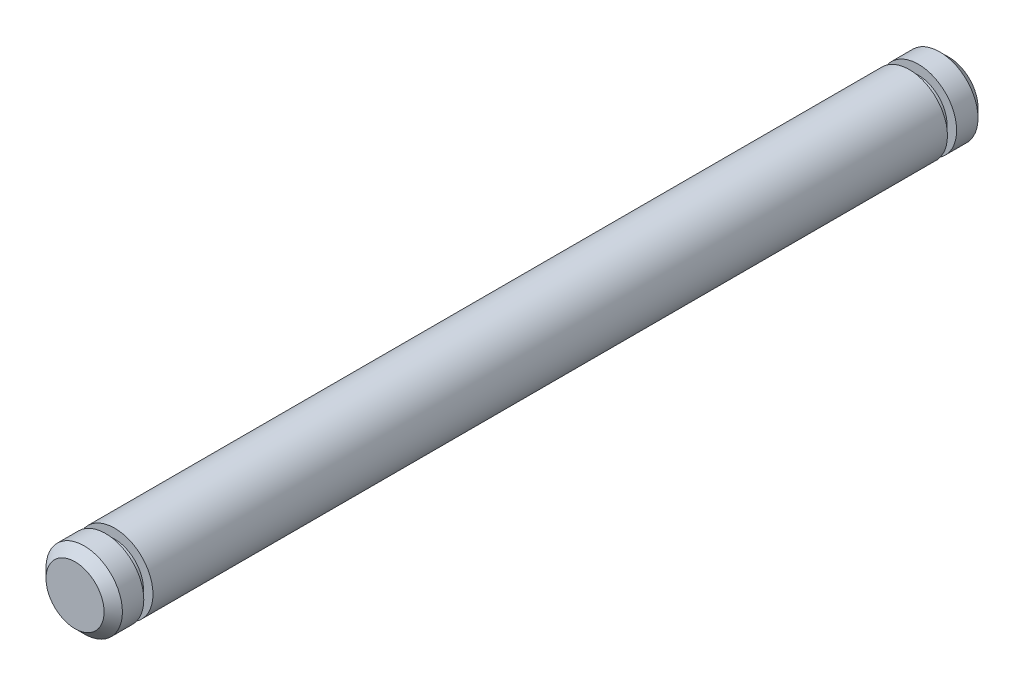
ISO-10303-21;
HEADER;
FILE_DESCRIPTION(('STEP AP214'),'2;1');
FILE_NAME('part.step','',(''),(''),'','','');
FILE_SCHEMA(('AUTOMOTIVE_DESIGN { 1 0 10303 214 1 1 1 1 }'));
ENDSEC;
DATA;
#1=APPLICATION_CONTEXT('core data for automotive mechanical design processes');
#2=APPLICATION_PROTOCOL_DEFINITION('international standard','automotive_design',2000,#1);
#3=PRODUCT_CONTEXT('',#1,'mechanical');
#4=PRODUCT('Part','Part','',(#3));
#5=PRODUCT_RELATED_PRODUCT_CATEGORY('part','',(#4));
#6=PRODUCT_DEFINITION_FORMATION('','',#4);
#7=PRODUCT_DEFINITION_CONTEXT('part definition',#1,'design');
#8=PRODUCT_DEFINITION('design','',#6,#7);
#9=PRODUCT_DEFINITION_SHAPE('','',#8);
#10=(LENGTH_UNIT() NAMED_UNIT(*) SI_UNIT(.MILLI.,.METRE.));
#11=(NAMED_UNIT(*) PLANE_ANGLE_UNIT() SI_UNIT($,.RADIAN.));
#12=(NAMED_UNIT(*) SI_UNIT($,.STERADIAN.) SOLID_ANGLE_UNIT());
#13=UNCERTAINTY_MEASURE_WITH_UNIT(LENGTH_MEASURE(1.E-05),#10,'distance_accuracy_value','');
#14=(GEOMETRIC_REPRESENTATION_CONTEXT(3) GLOBAL_UNCERTAINTY_ASSIGNED_CONTEXT((#13)) GLOBAL_UNIT_ASSIGNED_CONTEXT((#10,
#11,#12)) REPRESENTATION_CONTEXT('',''));
#15=CARTESIAN_POINT('',(0.,0.,0.));
#16=DIRECTION('',(0.,0.,1.));
#17=DIRECTION('',(1.,0.,0.));
#18=AXIS2_PLACEMENT_3D('',#15,#16,#17);
#19=CARTESIAN_POINT('',(0.,0.,16.50746));
#20=DIRECTION('',(0.,0.,-1.));
#21=DIRECTION('',(-1.,0.,0.));
#22=AXIS2_PLACEMENT_3D('',#19,#20,#21);
#23=CYLINDRICAL_SURFACE('',#22,1.5875);
#24=CARTESIAN_POINT('',(0.,0.,16.50746));
#25=DIRECTION('',(0.,0.,1.));
#26=DIRECTION('',(1.,0.,0.));
#27=AXIS2_PLACEMENT_3D('',#24,#25,#26);
#28=CIRCLE('',#27,1.5875);
#29=CARTESIAN_POINT('',(1.5875,0.,16.50746));
#30=VERTEX_POINT('',#29);
#31=EDGE_CURVE('E68',#30,#30,#28,.T.);
#32=ORIENTED_EDGE('',*,*,#31,.F.);
#33=EDGE_LOOP('',(#32));
#34=FACE_BOUND('',#33,.T.);
#35=CARTESIAN_POINT('',(0.,0.,-16.50746));
#36=DIRECTION('',(0.,0.,1.));
#37=DIRECTION('',(1.,0.,0.));
#38=AXIS2_PLACEMENT_3D('',#35,#36,#37);
#39=CIRCLE('',#38,1.5875);
#40=CARTESIAN_POINT('',(1.5875,0.,-16.50746));
#41=VERTEX_POINT('',#40);
#42=EDGE_CURVE('E65',#41,#41,#39,.T.);
#43=ORIENTED_EDGE('',*,*,#42,.T.);
#44=EDGE_LOOP('',(#43));
#45=FACE_BOUND('',#44,.T.);
#46=ADVANCED_FACE('F43',(#34,#45),#23,.T.);
#47=CARTESIAN_POINT('',(0.,0.,16.50746));
#48=DIRECTION('',(0.,0.,1.));
#49=DIRECTION('',(1.,0.,0.));
#50=AXIS2_PLACEMENT_3D('',#47,#48,#49);
#51=PLANE('',#50);
#52=CARTESIAN_POINT('',(0.,0.,16.50746));
#53=DIRECTION('',(0.,0.,1.));
#54=DIRECTION('',(1.,0.,0.));
#55=AXIS2_PLACEMENT_3D('',#52,#53,#54);
#56=CIRCLE('',#55,1.19126);
#57=CARTESIAN_POINT('',(-1.19126,0.,16.50746));
#58=VERTEX_POINT('',#57);
#59=EDGE_CURVE('E64',#58,#58,#56,.T.);
#60=ORIENTED_EDGE('',*,*,#59,.F.);
#61=EDGE_LOOP('',(#60));
#62=FACE_BOUND('',#61,.T.);
#63=ORIENTED_EDGE('',*,*,#31,.T.);
#64=EDGE_LOOP('',(#63));
#65=FACE_BOUND('',#64,.T.);
#66=ADVANCED_FACE('F106',(#62,#65),#51,.T.);
#67=CARTESIAN_POINT('',(0.,0.,-16.50746));
#68=DIRECTION('',(0.,0.,1.));
#69=DIRECTION('',(1.,0.,0.));
#70=AXIS2_PLACEMENT_3D('',#67,#68,#69);
#71=PLANE('',#70);
#72=CARTESIAN_POINT('',(0.,0.,-16.50746));
#73=DIRECTION('',(0.,0.,1.));
#74=DIRECTION('',(1.,0.,0.));
#75=AXIS2_PLACEMENT_3D('',#72,#73,#74);
#76=CIRCLE('',#75,1.19126);
#77=CARTESIAN_POINT('',(1.19126,0.,-16.50746));
#78=VERTEX_POINT('',#77);
#79=EDGE_CURVE('E79',#78,#78,#76,.T.);
#80=ORIENTED_EDGE('',*,*,#79,.T.);
#81=EDGE_LOOP('',(#80));
#82=FACE_BOUND('',#81,.T.);
#83=ORIENTED_EDGE('',*,*,#42,.F.);
#84=EDGE_LOOP('',(#83));
#85=FACE_BOUND('',#84,.T.);
#86=ADVANCED_FACE('F112',(#82,#85),#71,.F.);
#87=CARTESIAN_POINT('',(0.,0.,16.88846));
#88=DIRECTION('',(0.,0.,-1.));
#89=DIRECTION('',(-1.,0.,0.));
#90=AXIS2_PLACEMENT_3D('',#87,#88,#89);
#91=CYLINDRICAL_SURFACE('',#90,1.19126);
#92=CARTESIAN_POINT('',(0.,0.,16.88846));
#93=DIRECTION('',(0.,0.,1.));
#94=DIRECTION('',(1.,0.,0.));
#95=AXIS2_PLACEMENT_3D('',#92,#93,#94);
#96=CIRCLE('',#95,1.19126);
#97=CARTESIAN_POINT('',(-1.19126,0.,16.88846));
#98=VERTEX_POINT('',#97);
#99=EDGE_CURVE('E69',#98,#98,#96,.T.);
#100=CARTESIAN_POINT('',(-1.19126,0.,16.88846));
#101=CARTESIAN_POINT('',(-1.19126,0.,16.88449125));
#102=CARTESIAN_POINT('',(-1.19126,0.,16.8805225));
#103=CARTESIAN_POINT('',(-1.19126,0.,16.872585));
#104=CARTESIAN_POINT('',(-1.19126,0.,16.86861625));
#105=CARTESIAN_POINT('',(-1.19126,0.,16.86067875));
#106=CARTESIAN_POINT('',(-1.19126,0.,16.85671));
#107=CARTESIAN_POINT('',(-1.19126,0.,16.8487725));
#108=CARTESIAN_POINT('',(-1.19126,0.,16.84480375));
#109=CARTESIAN_POINT('',(-1.19126,0.,16.83686625));
#110=CARTESIAN_POINT('',(-1.19126,0.,16.8328975));
#111=CARTESIAN_POINT('',(-1.19126,0.,16.82496));
#112=CARTESIAN_POINT('',(-1.19126,0.,16.82099125));
#113=CARTESIAN_POINT('',(-1.19126,0.,16.81305375));
#114=CARTESIAN_POINT('',(-1.19126,0.,16.809085));
#115=CARTESIAN_POINT('',(-1.19126,0.,16.8011475));
#116=CARTESIAN_POINT('',(-1.19126,0.,16.79717875));
#117=CARTESIAN_POINT('',(-1.19126,0.,16.78924125));
#118=CARTESIAN_POINT('',(-1.19126,0.,16.7852725));
#119=CARTESIAN_POINT('',(-1.19126,0.,16.777335));
#120=CARTESIAN_POINT('',(-1.19126,0.,16.77336625));
#121=CARTESIAN_POINT('',(-1.19126,0.,16.76542875));
#122=CARTESIAN_POINT('',(-1.19126,0.,16.76146));
#123=CARTESIAN_POINT('',(-1.19126,0.,16.7535225));
#124=CARTESIAN_POINT('',(-1.19126,0.,16.74955375));
#125=CARTESIAN_POINT('',(-1.19126,0.,16.74161625));
#126=CARTESIAN_POINT('',(-1.19126,0.,16.7376475));
#127=CARTESIAN_POINT('',(-1.19126,0.,16.72971));
#128=CARTESIAN_POINT('',(-1.19126,0.,16.72574125));
#129=CARTESIAN_POINT('',(-1.19126,0.,16.71780375));
#130=CARTESIAN_POINT('',(-1.19126,0.,16.713835));
#131=CARTESIAN_POINT('',(-1.19126,0.,16.7058975));
#132=CARTESIAN_POINT('',(-1.19126,0.,16.70192875));
#133=CARTESIAN_POINT('',(-1.19126,0.,16.69399125));
#134=CARTESIAN_POINT('',(-1.19126,0.,16.6900225));
#135=CARTESIAN_POINT('',(-1.19126,0.,16.682085));
#136=CARTESIAN_POINT('',(-1.19126,0.,16.67811625));
#137=CARTESIAN_POINT('',(-1.19126,0.,16.67017875));
#138=CARTESIAN_POINT('',(-1.19126,0.,16.66621));
#139=CARTESIAN_POINT('',(-1.19126,0.,16.6582725));
#140=CARTESIAN_POINT('',(-1.19126,0.,16.65430375));
#141=CARTESIAN_POINT('',(-1.19126,0.,16.64636625));
#142=CARTESIAN_POINT('',(-1.19126,0.,16.6423975));
#143=CARTESIAN_POINT('',(-1.19126,0.,16.63446));
#144=CARTESIAN_POINT('',(-1.19126,0.,16.63049125));
#145=CARTESIAN_POINT('',(-1.19126,0.,16.62255375));
#146=CARTESIAN_POINT('',(-1.19126,0.,16.618585));
#147=CARTESIAN_POINT('',(-1.19126,0.,16.6106475));
#148=CARTESIAN_POINT('',(-1.19126,0.,16.60667875));
#149=CARTESIAN_POINT('',(-1.19126,0.,16.59874125));
#150=CARTESIAN_POINT('',(-1.19126,0.,16.5947725));
#151=CARTESIAN_POINT('',(-1.19126,0.,16.586835));
#152=CARTESIAN_POINT('',(-1.19126,0.,16.58286625));
#153=CARTESIAN_POINT('',(-1.19126,0.,16.57492875));
#154=CARTESIAN_POINT('',(-1.19126,0.,16.57096));
#155=CARTESIAN_POINT('',(-1.19126,0.,16.5630225));
#156=CARTESIAN_POINT('',(-1.19126,0.,16.55905375));
#157=CARTESIAN_POINT('',(-1.19126,0.,16.55111625));
#158=CARTESIAN_POINT('',(-1.19126,0.,16.5471475));
#159=CARTESIAN_POINT('',(-1.19126,0.,16.53921));
#160=CARTESIAN_POINT('',(-1.19126,0.,16.53524125));
#161=CARTESIAN_POINT('',(-1.19126,0.,16.52730375));
#162=CARTESIAN_POINT('',(-1.19126,0.,16.523335));
#163=CARTESIAN_POINT('',(-1.19126,0.,16.5153975));
#164=CARTESIAN_POINT('',(-1.19126,0.,16.51142875));
#165=CARTESIAN_POINT('',(-1.19126,0.,16.50746));
#166=B_SPLINE_CURVE_WITH_KNOTS('',3,(#100,#101,#102,#103,#104,#105,#106,#107,#108,#109,#110,
#111,#112,#113,#114,#115,#116,#117,#118,#119,#120,#121,#122,#123,#124,#125,#126,#127,#128,#129,
#130,#131,#132,#133,#134,#135,#136,#137,#138,#139,#140,#141,#142,#143,#144,#145,#146,#147,#148,
#149,#150,#151,#152,#153,#154,#155,#156,#157,#158,#159,#160,#161,#162,#163,#164,#165),
.UNSPECIFIED.,.F.,.F.,(4,2,2,2,2,2,2,2,2,2,2,2,2,2,2,2,2,2,2,2,2,2,2,2,2,2,2,2,2,2,2,2,4),(0.,
0.0119062499999989,0.0238124999999978,0.0357187499999967,0.0476249999999991,0.059531249999998,
0.0714374999999969,0.0833437499999992,0.0952499999999981,0.107156249999997,0.119062499999999,
0.130968749999998,0.142874999999997,0.15478125,0.166687499999998,0.178593749999997,0.1905,
0.202406249999999,0.214312499999997,0.226218749999996,0.238124999999999,0.250031249999998,
0.261937499999997,0.273843749999999,0.285749999999998,0.297656249999997,0.309562499999999,
0.321468749999998,0.333374999999997,0.345281249999999,0.357187499999998,0.369093749999997,
0.380999999999999),.UNSPECIFIED.);
#167=EDGE_CURVE('BSEAM141',#98,#58,#166,.T.);
#168=ORIENTED_EDGE('',*,*,#99,.F.);
#169=ORIENTED_EDGE('',*,*,#59,.T.);
#170=ORIENTED_EDGE('',*,*,#167,.T.);
#171=ORIENTED_EDGE('',*,*,#167,.F.);
#172=EDGE_LOOP('',(#168,#170,#169,#171));
#173=FACE_BOUND('',#172,.T.);
#174=ADVANCED_FACE('F141',(#173),#91,.T.);
#175=CARTESIAN_POINT('',(0.,0.,18.15846));
#176=DIRECTION('',(0.,0.,-1.));
#177=DIRECTION('',(-1.,0.,0.));
#178=AXIS2_PLACEMENT_3D('',#175,#176,#177);
#179=CYLINDRICAL_SURFACE('',#178,1.5875);
#180=CARTESIAN_POINT('',(0.,0.,17.77746));
#181=DIRECTION('',(0.,0.,1.));
#182=DIRECTION('',(1.,0.,0.));
#183=AXIS2_PLACEMENT_3D('',#180,#181,#182);
#184=CIRCLE('',#183,1.5875);
#185=CARTESIAN_POINT('',(1.5875,0.,17.77746));
#186=VERTEX_POINT('',#185);
#187=EDGE_CURVE('E55',#186,#186,#184,.F.);
#188=ORIENTED_EDGE('',*,*,#187,.T.);
#189=EDGE_LOOP('',(#188));
#190=FACE_BOUND('',#189,.T.);
#191=CARTESIAN_POINT('',(0.,0.,16.88846));
#192=DIRECTION('',(0.,0.,1.));
#193=DIRECTION('',(1.,0.,0.));
#194=AXIS2_PLACEMENT_3D('',#191,#192,#193);
#195=CIRCLE('',#194,1.5875);
#196=CARTESIAN_POINT('',(1.5875,0.,16.88846));
#197=VERTEX_POINT('',#196);
#198=EDGE_CURVE('E76',#197,#197,#195,.T.);
#199=ORIENTED_EDGE('',*,*,#198,.T.);
#200=EDGE_LOOP('',(#199));
#201=FACE_BOUND('',#200,.T.);
#202=ADVANCED_FACE('F136',(#190,#201),#179,.T.);
#203=CARTESIAN_POINT('',(0.,0.,18.15846));
#204=DIRECTION('',(0.,0.,1.));
#205=DIRECTION('',(1.,0.,0.));
#206=AXIS2_PLACEMENT_3D('',#203,#204,#205);
#207=PLANE('',#206);
#208=CARTESIAN_POINT('',(0.,0.,18.15846));
#209=DIRECTION('',(0.,0.,1.));
#210=DIRECTION('',(1.,0.,0.));
#211=AXIS2_PLACEMENT_3D('',#208,#209,#210);
#212=CIRCLE('',#211,1.2065);
#213=CARTESIAN_POINT('',(1.2065,0.,18.15846));
#214=VERTEX_POINT('',#213);
#215=EDGE_CURVE('E59',#214,#214,#212,.T.);
#216=ORIENTED_EDGE('',*,*,#215,.T.);
#217=EDGE_LOOP('',(#216));
#218=FACE_BOUND('',#217,.T.);
#219=ADVANCED_FACE('F129',(#218),#207,.T.);
#220=CARTESIAN_POINT('',(0.,0.,16.88846));
#221=DIRECTION('',(0.,0.,1.));
#222=DIRECTION('',(1.,0.,0.));
#223=AXIS2_PLACEMENT_3D('',#220,#221,#222);
#224=PLANE('',#223);
#225=ORIENTED_EDGE('',*,*,#99,.T.);
#226=EDGE_LOOP('',(#225));
#227=FACE_BOUND('',#226,.T.);
#228=ORIENTED_EDGE('',*,*,#198,.F.);
#229=EDGE_LOOP('',(#228));
#230=FACE_BOUND('',#229,.T.);
#231=ADVANCED_FACE('F122',(#227,#230),#224,.F.);
#232=CARTESIAN_POINT('',(0.,0.,18.15846));
#233=DIRECTION('',(0.,0.,-1.));
#234=DIRECTION('',(-1.,0.,0.));
#235=AXIS2_PLACEMENT_3D('',#232,#233,#234);
#236=CONICAL_SURFACE('',#235,1.2065,0.78539816339745);
#237=ORIENTED_EDGE('',*,*,#187,.F.);
#238=EDGE_LOOP('',(#237));
#239=FACE_BOUND('',#238,.T.);
#240=ORIENTED_EDGE('',*,*,#215,.F.);
#241=EDGE_LOOP('',(#240));
#242=FACE_BOUND('',#241,.T.);
#243=ADVANCED_FACE('F101',(#239,#242),#236,.T.);
#244=CARTESIAN_POINT('',(0.,0.,-16.88846));
#245=DIRECTION('',(0.,0.,1.));
#246=DIRECTION('',(1.,0.,0.));
#247=AXIS2_PLACEMENT_3D('',#244,#245,#246);
#248=CYLINDRICAL_SURFACE('',#247,1.19126);
#249=CARTESIAN_POINT('',(0.,0.,-16.88846));
#250=DIRECTION('',(0.,0.,1.));
#251=DIRECTION('',(1.,0.,0.));
#252=AXIS2_PLACEMENT_3D('',#249,#250,#251);
#253=CIRCLE('',#252,1.19126);
#254=CARTESIAN_POINT('',(1.19126,0.,-16.88846));
#255=VERTEX_POINT('',#254);
#256=EDGE_CURVE('E82',#255,#255,#253,.T.);
#257=CARTESIAN_POINT('',(1.19126,0.,-16.88846));
#258=CARTESIAN_POINT('',(1.19126,0.,-16.88449125));
#259=CARTESIAN_POINT('',(1.19126,0.,-16.8805225));
#260=CARTESIAN_POINT('',(1.19126,0.,-16.872585));
#261=CARTESIAN_POINT('',(1.19126,0.,-16.86861625));
#262=CARTESIAN_POINT('',(1.19126,0.,-16.86067875));
#263=CARTESIAN_POINT('',(1.19126,0.,-16.85671));
#264=CARTESIAN_POINT('',(1.19126,0.,-16.8487725));
#265=CARTESIAN_POINT('',(1.19126,0.,-16.84480375));
#266=CARTESIAN_POINT('',(1.19126,0.,-16.83686625));
#267=CARTESIAN_POINT('',(1.19126,0.,-16.8328975));
#268=CARTESIAN_POINT('',(1.19126,0.,-16.82496));
#269=CARTESIAN_POINT('',(1.19126,0.,-16.82099125));
#270=CARTESIAN_POINT('',(1.19126,0.,-16.81305375));
#271=CARTESIAN_POINT('',(1.19126,0.,-16.809085));
#272=CARTESIAN_POINT('',(1.19126,0.,-16.8011475));
#273=CARTESIAN_POINT('',(1.19126,0.,-16.79717875));
#274=CARTESIAN_POINT('',(1.19126,0.,-16.78924125));
#275=CARTESIAN_POINT('',(1.19126,0.,-16.7852725));
#276=CARTESIAN_POINT('',(1.19126,0.,-16.777335));
#277=CARTESIAN_POINT('',(1.19126,0.,-16.77336625));
#278=CARTESIAN_POINT('',(1.19126,0.,-16.76542875));
#279=CARTESIAN_POINT('',(1.19126,0.,-16.76146));
#280=CARTESIAN_POINT('',(1.19126,0.,-16.7535225));
#281=CARTESIAN_POINT('',(1.19126,0.,-16.74955375));
#282=CARTESIAN_POINT('',(1.19126,0.,-16.74161625));
#283=CARTESIAN_POINT('',(1.19126,0.,-16.7376475));
#284=CARTESIAN_POINT('',(1.19126,0.,-16.72971));
#285=CARTESIAN_POINT('',(1.19126,0.,-16.72574125));
#286=CARTESIAN_POINT('',(1.19126,0.,-16.71780375));
#287=CARTESIAN_POINT('',(1.19126,0.,-16.713835));
#288=CARTESIAN_POINT('',(1.19126,0.,-16.7058975));
#289=CARTESIAN_POINT('',(1.19126,0.,-16.70192875));
#290=CARTESIAN_POINT('',(1.19126,0.,-16.69399125));
#291=CARTESIAN_POINT('',(1.19126,0.,-16.6900225));
#292=CARTESIAN_POINT('',(1.19126,0.,-16.682085));
#293=CARTESIAN_POINT('',(1.19126,0.,-16.67811625));
#294=CARTESIAN_POINT('',(1.19126,0.,-16.67017875));
#295=CARTESIAN_POINT('',(1.19126,0.,-16.66621));
#296=CARTESIAN_POINT('',(1.19126,0.,-16.6582725));
#297=CARTESIAN_POINT('',(1.19126,0.,-16.65430375));
#298=CARTESIAN_POINT('',(1.19126,0.,-16.64636625));
#299=CARTESIAN_POINT('',(1.19126,0.,-16.6423975));
#300=CARTESIAN_POINT('',(1.19126,0.,-16.63446));
#301=CARTESIAN_POINT('',(1.19126,0.,-16.63049125));
#302=CARTESIAN_POINT('',(1.19126,0.,-16.62255375));
#303=CARTESIAN_POINT('',(1.19126,0.,-16.618585));
#304=CARTESIAN_POINT('',(1.19126,0.,-16.6106475));
#305=CARTESIAN_POINT('',(1.19126,0.,-16.60667875));
#306=CARTESIAN_POINT('',(1.19126,0.,-16.59874125));
#307=CARTESIAN_POINT('',(1.19126,0.,-16.5947725));
#308=CARTESIAN_POINT('',(1.19126,0.,-16.586835));
#309=CARTESIAN_POINT('',(1.19126,0.,-16.58286625));
#310=CARTESIAN_POINT('',(1.19126,0.,-16.57492875));
#311=CARTESIAN_POINT('',(1.19126,0.,-16.57096));
#312=CARTESIAN_POINT('',(1.19126,0.,-16.5630225));
#313=CARTESIAN_POINT('',(1.19126,0.,-16.55905375));
#314=CARTESIAN_POINT('',(1.19126,0.,-16.55111625));
#315=CARTESIAN_POINT('',(1.19126,0.,-16.5471475));
#316=CARTESIAN_POINT('',(1.19126,0.,-16.53921));
#317=CARTESIAN_POINT('',(1.19126,0.,-16.53524125));
#318=CARTESIAN_POINT('',(1.19126,0.,-16.52730375));
#319=CARTESIAN_POINT('',(1.19126,0.,-16.523335));
#320=CARTESIAN_POINT('',(1.19126,0.,-16.5153975));
#321=CARTESIAN_POINT('',(1.19126,0.,-16.51142875));
#322=CARTESIAN_POINT('',(1.19126,0.,-16.50746));
#323=B_SPLINE_CURVE_WITH_KNOTS('',3,(#257,#258,#259,#260,#261,#262,#263,#264,#265,#266,#267,
#268,#269,#270,#271,#272,#273,#274,#275,#276,#277,#278,#279,#280,#281,#282,#283,#284,#285,#286,
#287,#288,#289,#290,#291,#292,#293,#294,#295,#296,#297,#298,#299,#300,#301,#302,#303,#304,#305,
#306,#307,#308,#309,#310,#311,#312,#313,#314,#315,#316,#317,#318,#319,#320,#321,#322),
.UNSPECIFIED.,.F.,.F.,(4,2,2,2,2,2,2,2,2,2,2,2,2,2,2,2,2,2,2,2,2,2,2,2,2,2,2,2,2,2,2,2,4),(0.,
0.0119062500000024,0.0238125000000013,0.0357187500000002,0.0476250000000025,0.0595312500000014,
0.0714375000000003,0.0833437500000027,0.0952500000000016,0.10715625,0.119062500000003,
0.130968750000002,0.142875000000001,0.154781250000003,0.166687500000002,0.178593750000001,
0.1905,0.202406250000002,0.214312500000001,0.22621875,0.238125000000002,0.250031250000001,
0.2619375,0.273843750000002,0.285750000000001,0.29765625,0.309562500000003,0.321468750000001,
0.333375,0.345281250000003,0.357187500000002,0.36909375,0.380999999999999),.UNSPECIFIED.);
#324=EDGE_CURVE('BSEAM94',#255,#78,#323,.T.);
#325=ORIENTED_EDGE('',*,*,#256,.T.);
#326=ORIENTED_EDGE('',*,*,#79,.F.);
#327=ORIENTED_EDGE('',*,*,#324,.T.);
#328=ORIENTED_EDGE('',*,*,#324,.F.);
#329=EDGE_LOOP('',(#325,#327,#326,#328));
#330=FACE_BOUND('',#329,.T.);
#331=ADVANCED_FACE('F94',(#330),#248,.T.);
#332=CARTESIAN_POINT('',(0.,0.,-18.15846));
#333=DIRECTION('',(0.,0.,1.));
#334=DIRECTION('',(1.,0.,0.));
#335=AXIS2_PLACEMENT_3D('',#332,#333,#334);
#336=CYLINDRICAL_SURFACE('',#335,1.5875);
#337=CARTESIAN_POINT('',(0.,0.,-17.77746));
#338=DIRECTION('',(0.,0.,-1.));
#339=DIRECTION('',(-1.,0.,0.));
#340=AXIS2_PLACEMENT_3D('',#337,#338,#339);
#341=CIRCLE('',#340,1.5875);
#342=CARTESIAN_POINT('',(1.5875,0.,-17.77746));
#343=VERTEX_POINT('',#342);
#344=EDGE_CURVE('E51',#343,#343,#341,.F.);
#345=ORIENTED_EDGE('',*,*,#344,.T.);
#346=EDGE_LOOP('',(#345));
#347=FACE_BOUND('',#346,.T.);
#348=CARTESIAN_POINT('',(0.,0.,-16.88846));
#349=DIRECTION('',(0.,0.,1.));
#350=DIRECTION('',(1.,0.,0.));
#351=AXIS2_PLACEMENT_3D('',#348,#349,#350);
#352=CIRCLE('',#351,1.5875);
#353=CARTESIAN_POINT('',(1.5875,0.,-16.88846));
#354=VERTEX_POINT('',#353);
#355=EDGE_CURVE('E85',#354,#354,#352,.T.);
#356=ORIENTED_EDGE('',*,*,#355,.F.);
#357=EDGE_LOOP('',(#356));
#358=FACE_BOUND('',#357,.T.);
#359=ADVANCED_FACE('F91',(#347,#358),#336,.T.);
#360=CARTESIAN_POINT('',(0.,0.,-18.15846));
#361=DIRECTION('',(0.,0.,-1.));
#362=DIRECTION('',(1.,0.,0.));
#363=AXIS2_PLACEMENT_3D('',#360,#361,#362);
#364=PLANE('',#363);
#365=CARTESIAN_POINT('',(0.,0.,-18.15846));
#366=DIRECTION('',(0.,0.,-1.));
#367=DIRECTION('',(-1.,0.,0.));
#368=AXIS2_PLACEMENT_3D('',#365,#366,#367);
#369=CIRCLE('',#368,1.2065);
#370=CARTESIAN_POINT('',(1.2065,0.,-18.15846));
#371=VERTEX_POINT('',#370);
#372=EDGE_CURVE('E10',#371,#371,#369,.T.);
#373=ORIENTED_EDGE('',*,*,#372,.T.);
#374=EDGE_LOOP('',(#373));
#375=FACE_BOUND('',#374,.T.);
#376=ADVANCED_FACE('F93',(#375),#364,.T.);
#377=CARTESIAN_POINT('',(0.,0.,-16.88846));
#378=DIRECTION('',(0.,0.,-1.));
#379=DIRECTION('',(1.,0.,0.));
#380=AXIS2_PLACEMENT_3D('',#377,#378,#379);
#381=PLANE('',#380);
#382=ORIENTED_EDGE('',*,*,#256,.F.);
#383=EDGE_LOOP('',(#382));
#384=FACE_BOUND('',#383,.T.);
#385=ORIENTED_EDGE('',*,*,#355,.T.);
#386=EDGE_LOOP('',(#385));
#387=FACE_BOUND('',#386,.T.);
#388=ADVANCED_FACE('F89',(#384,#387),#381,.F.);
#389=CARTESIAN_POINT('',(0.,0.,-17.77746));
#390=DIRECTION('',(0.,0.,1.));
#391=DIRECTION('',(1.,0.,0.));
#392=AXIS2_PLACEMENT_3D('',#389,#390,#391);
#393=CONICAL_SURFACE('',#392,1.5875,0.785398163397443);
#394=CARTESIAN_POINT('',(1.2065,0.,-18.15846));
#395=CARTESIAN_POINT('',(1.21046875,0.,-18.15449125));
#396=CARTESIAN_POINT('',(1.2144375,0.,-18.1505225));
#397=CARTESIAN_POINT('',(1.222375,0.,-18.142585));
#398=CARTESIAN_POINT('',(1.22634375,0.,-18.13861625));
#399=CARTESIAN_POINT('',(1.23428125,0.,-18.13067875));
#400=CARTESIAN_POINT('',(1.23825,0.,-18.12671));
#401=CARTESIAN_POINT('',(1.2461875,0.,-18.1187725));
#402=CARTESIAN_POINT('',(1.25015625,0.,-18.11480375));
#403=CARTESIAN_POINT('',(1.25809375,0.,-18.10686625));
#404=CARTESIAN_POINT('',(1.2620625,0.,-18.1028975));
#405=CARTESIAN_POINT('',(1.27,0.,-18.09496));
#406=CARTESIAN_POINT('',(1.27396875,0.,-18.09099125));
#407=CARTESIAN_POINT('',(1.28190625,0.,-18.08305375));
#408=CARTESIAN_POINT('',(1.285875,0.,-18.079085));
#409=CARTESIAN_POINT('',(1.2938125,0.,-18.0711475));
#410=CARTESIAN_POINT('',(1.29778125,0.,-18.06717875));
#411=CARTESIAN_POINT('',(1.30571875,0.,-18.05924125));
#412=CARTESIAN_POINT('',(1.3096875,0.,-18.0552725));
#413=CARTESIAN_POINT('',(1.317625,0.,-18.047335));
#414=CARTESIAN_POINT('',(1.32159375,0.,-18.04336625));
#415=CARTESIAN_POINT('',(1.32953125,0.,-18.03542875));
#416=CARTESIAN_POINT('',(1.3335,0.,-18.03146));
#417=CARTESIAN_POINT('',(1.3414375,0.,-18.0235225));
#418=CARTESIAN_POINT('',(1.34540625,0.,-18.01955375));
#419=CARTESIAN_POINT('',(1.35334375,0.,-18.01161625));
#420=CARTESIAN_POINT('',(1.3573125,0.,-18.0076475));
#421=CARTESIAN_POINT('',(1.36525,0.,-17.99971));
#422=CARTESIAN_POINT('',(1.36921875,0.,-17.99574125));
#423=CARTESIAN_POINT('',(1.37715625,0.,-17.98780375));
#424=CARTESIAN_POINT('',(1.381125,0.,-17.983835));
#425=CARTESIAN_POINT('',(1.3890625,0.,-17.9758975));
#426=CARTESIAN_POINT('',(1.39303125,0.,-17.97192875));
#427=CARTESIAN_POINT('',(1.40096875,0.,-17.96399125));
#428=CARTESIAN_POINT('',(1.4049375,0.,-17.9600225));
#429=CARTESIAN_POINT('',(1.412875,0.,-17.952085));
#430=CARTESIAN_POINT('',(1.41684375,0.,-17.94811625));
#431=CARTESIAN_POINT('',(1.42478125,0.,-17.94017875));
#432=CARTESIAN_POINT('',(1.42875,0.,-17.93621));
#433=CARTESIAN_POINT('',(1.4366875,0.,-17.9282725));
#434=CARTESIAN_POINT('',(1.44065625,0.,-17.92430375));
#435=CARTESIAN_POINT('',(1.44859375,0.,-17.91636625));
#436=CARTESIAN_POINT('',(1.4525625,0.,-17.9123975));
#437=CARTESIAN_POINT('',(1.4605,0.,-17.90446));
#438=CARTESIAN_POINT('',(1.46446875,0.,-17.90049125));
#439=CARTESIAN_POINT('',(1.47240625,0.,-17.89255375));
#440=CARTESIAN_POINT('',(1.476375,0.,-17.888585));
#441=CARTESIAN_POINT('',(1.4843125,0.,-17.8806475));
#442=CARTESIAN_POINT('',(1.48828125,0.,-17.87667875));
#443=CARTESIAN_POINT('',(1.49621875,0.,-17.86874125));
#444=CARTESIAN_POINT('',(1.5001875,0.,-17.8647725));
#445=CARTESIAN_POINT('',(1.508125,0.,-17.856835));
#446=CARTESIAN_POINT('',(1.51209375,0.,-17.85286625));
#447=CARTESIAN_POINT('',(1.52003125,0.,-17.84492875));
#448=CARTESIAN_POINT('',(1.524,0.,-17.84096));
#449=CARTESIAN_POINT('',(1.5319375,0.,-17.8330225));
#450=CARTESIAN_POINT('',(1.53590625,0.,-17.82905375));
#451=CARTESIAN_POINT('',(1.54384375,0.,-17.82111625));
#452=CARTESIAN_POINT('',(1.5478125,0.,-17.8171475));
#453=CARTESIAN_POINT('',(1.55575,0.,-17.80921));
#454=CARTESIAN_POINT('',(1.55971875,0.,-17.80524125));
#455=CARTESIAN_POINT('',(1.56765625,0.,-17.79730375));
#456=CARTESIAN_POINT('',(1.571625,0.,-17.793335));
#457=CARTESIAN_POINT('',(1.5795625,0.,-17.7853975));
#458=CARTESIAN_POINT('',(1.58353125,0.,-17.78142875));
#459=CARTESIAN_POINT('',(1.5875,0.,-17.77746));
#460=B_SPLINE_CURVE_WITH_KNOTS('',3,(#394,#395,#396,#397,#398,#399,#400,#401,#402,#403,#404,
#405,#406,#407,#408,#409,#410,#411,#412,#413,#414,#415,#416,#417,#418,#419,#420,#421,#422,#423,
#424,#425,#426,#427,#428,#429,#430,#431,#432,#433,#434,#435,#436,#437,#438,#439,#440,#441,#442,
#443,#444,#445,#446,#447,#448,#449,#450,#451,#452,#453,#454,#455,#456,#457,#458,#459),
.UNSPECIFIED.,.F.,.F.,(4,2,2,2,2,2,2,2,2,2,2,2,2,2,2,2,2,2,2,2,2,2,2,2,2,2,2,2,2,2,2,2,4),(0.,
0.016837980227004,0.0336759604540079,0.0505139406810144,0.0673519209080182,0.0841899011350221,
0.101027881362029,0.117865861589033,0.134703841816039,0.151541822043043,0.168379802270047,
0.185217782497053,0.202055762724057,0.218893742951061,0.235731723178068,0.252569703405071,
0.269407683632078,0.286245663859082,0.303083644086086,0.319921624313092,0.336759604540096,
0.3535975847671,0.370435564994106,0.38727354522111,0.404111525448117,0.420949505675121,
0.437787485902124,0.454625466129131,0.471463446356135,0.488301426583139,0.505139406810145,
0.521977387037149,0.538815367264153),.UNSPECIFIED.);
#461=EDGE_CURVE('BSEAM46',#371,#343,#460,.T.);
#462=ORIENTED_EDGE('',*,*,#372,.F.);
#463=ORIENTED_EDGE('',*,*,#344,.F.);
#464=ORIENTED_EDGE('',*,*,#461,.T.);
#465=ORIENTED_EDGE('',*,*,#461,.F.);
#466=EDGE_LOOP('',(#462,#464,#463,#465));
#467=FACE_BOUND('',#466,.T.);
#468=ADVANCED_FACE('F46',(#467),#393,.T.);
#469=CLOSED_SHELL('',(#46,#66,#86,#174,#202,#219,#231,#243,#331,#359,#376,#388,#468));
#470=MANIFOLD_SOLID_BREP('B2',#469);
#471=ADVANCED_BREP_SHAPE_REPRESENTATION('',(#18,#470),#14);
#472=SHAPE_DEFINITION_REPRESENTATION(#9,#471);
ENDSEC;
END-ISO-10303-21;
